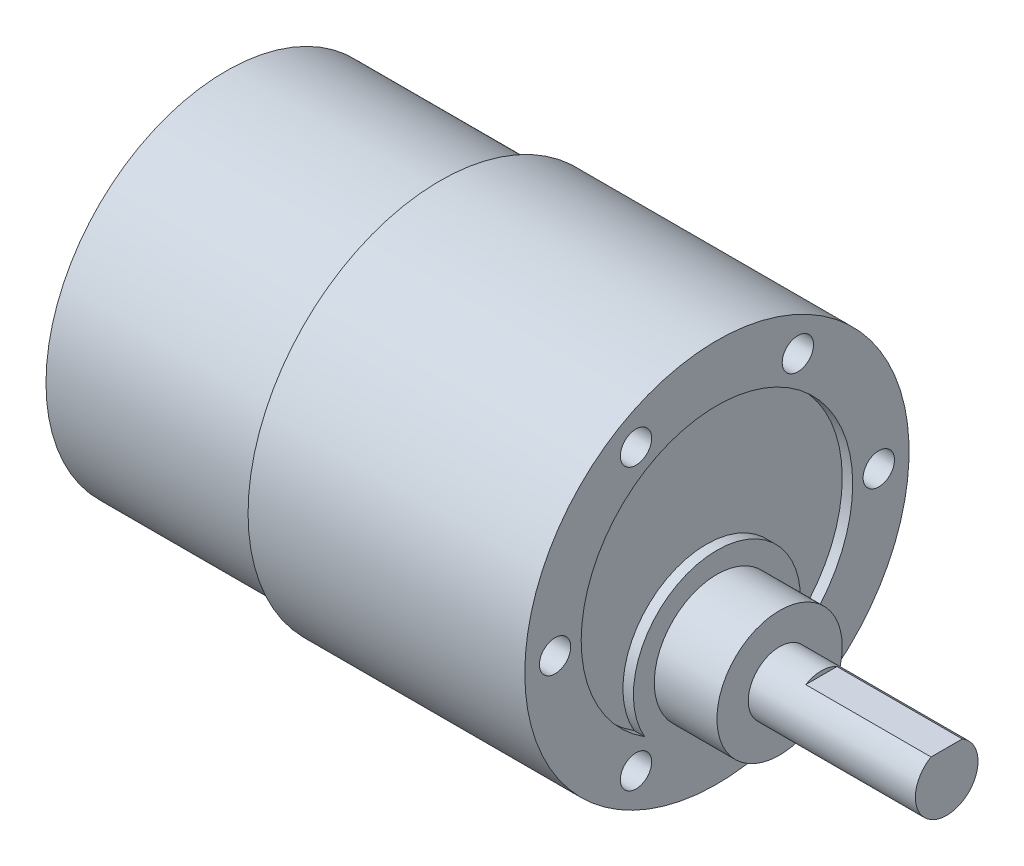
ISO-10303-21;
HEADER;
FILE_DESCRIPTION(('STEP AP214'),'2;1');
FILE_NAME('part.step','',(''),(''),'','','');
FILE_SCHEMA(('AUTOMOTIVE_DESIGN { 1 0 10303 214 1 1 1 1 }'));
ENDSEC;
DATA;
#1=APPLICATION_CONTEXT('core data for automotive mechanical design processes');
#2=APPLICATION_PROTOCOL_DEFINITION('international standard','automotive_design',2000,#1);
#3=PRODUCT_CONTEXT('',#1,'mechanical');
#4=PRODUCT('Part','Part','',(#3));
#5=PRODUCT_RELATED_PRODUCT_CATEGORY('part','',(#4));
#6=PRODUCT_DEFINITION_FORMATION('','',#4);
#7=PRODUCT_DEFINITION_CONTEXT('part definition',#1,'design');
#8=PRODUCT_DEFINITION('design','',#6,#7);
#9=PRODUCT_DEFINITION_SHAPE('','',#8);
#10=(LENGTH_UNIT() NAMED_UNIT(*) SI_UNIT(.MILLI.,.METRE.));
#11=(NAMED_UNIT(*) PLANE_ANGLE_UNIT() SI_UNIT($,.RADIAN.));
#12=(NAMED_UNIT(*) SI_UNIT($,.STERADIAN.) SOLID_ANGLE_UNIT());
#13=UNCERTAINTY_MEASURE_WITH_UNIT(LENGTH_MEASURE(1.E-05),#10,'distance_accuracy_value','');
#14=(GEOMETRIC_REPRESENTATION_CONTEXT(3) GLOBAL_UNCERTAINTY_ASSIGNED_CONTEXT((#13)) GLOBAL_UNIT_ASSIGNED_CONTEXT((#10,
#11,#12)) REPRESENTATION_CONTEXT('',''));
#15=CARTESIAN_POINT('',(0.,0.,0.));
#16=DIRECTION('',(0.,0.,1.));
#17=DIRECTION('',(1.,0.,0.));
#18=AXIS2_PLACEMENT_3D('',#15,#16,#17);
#19=CARTESIAN_POINT('',(-26.5,0.,0.));
#20=DIRECTION('',(-1.,0.,0.));
#21=DIRECTION('',(0.,0.,1.));
#22=AXIS2_PLACEMENT_3D('',#19,#20,#21);
#23=CYLINDRICAL_SURFACE('',#22,17.25);
#24=CARTESIAN_POINT('',(-26.5,0.,0.));
#25=DIRECTION('',(-1.,0.,0.));
#26=DIRECTION('',(0.,0.,1.));
#27=AXIS2_PLACEMENT_3D('',#24,#25,#26);
#28=CIRCLE('',#27,17.25);
#29=CARTESIAN_POINT('',(-26.5,0.,17.25));
#30=VERTEX_POINT('',#29);
#31=EDGE_CURVE('E11',#30,#30,#28,.T.);
#32=ORIENTED_EDGE('',*,*,#31,.T.);
#33=EDGE_LOOP('',(#32));
#34=FACE_BOUND('',#33,.T.);
#35=CARTESIAN_POINT('',(-47.,0.,0.));
#36=DIRECTION('',(-1.,0.,0.));
#37=DIRECTION('',(0.,0.,1.));
#38=AXIS2_PLACEMENT_3D('',#35,#36,#37);
#39=CIRCLE('',#38,17.25);
#40=CARTESIAN_POINT('',(-47.,0.,17.25));
#41=VERTEX_POINT('',#40);
#42=EDGE_CURVE('E87',#41,#41,#39,.T.);
#43=ORIENTED_EDGE('',*,*,#42,.F.);
#44=EDGE_LOOP('',(#43));
#45=FACE_BOUND('',#44,.T.);
#46=ADVANCED_FACE('F36',(#34,#45),#23,.T.);
#47=CARTESIAN_POINT('',(22.,-7.00000010430813,0.));
#48=DIRECTION('',(1.,0.,0.));
#49=DIRECTION('',(0.,0.,-1.));
#50=AXIS2_PLACEMENT_3D('',#47,#48,#49);
#51=PLANE('',#50);
#52=CARTESIAN_POINT('',(22.,-7.00000010430813,0.));
#53=DIRECTION('',(1.,0.,0.));
#54=DIRECTION('',(0.,0.,-1.));
#55=AXIS2_PLACEMENT_3D('',#52,#53,#54);
#56=CIRCLE('',#55,3.00000004470348);
#57=CARTESIAN_POINT('',(22.,-4.40000010430813,-1.49666304431589));
#58=VERTEX_POINT('',#57);
#59=CARTESIAN_POINT('',(22.,-4.40000010430813,1.49666304431589));
#60=VERTEX_POINT('',#59);
#61=EDGE_CURVE('E40',#58,#60,#56,.F.);
#62=ORIENTED_EDGE('',*,*,#61,.F.);
#63=DIRECTION('',(0.,0.,-1.));
#64=VECTOR('',#63,1.);
#65=CARTESIAN_POINT('',(22.,-4.40000010430813,-1.49666304431589));
#66=LINE('',#65,#64);
#67=EDGE_CURVE('E75',#58,#60,#66,.F.);
#68=ORIENTED_EDGE('',*,*,#67,.T.);
#69=EDGE_LOOP('',(#62,#68));
#70=FACE_BOUND('',#69,.T.);
#71=ADVANCED_FACE('F38',(#70),#51,.T.);
#72=CARTESIAN_POINT('',(22.,-4.40000010430813,-1.49666304431589));
#73=DIRECTION('',(0.,-1.,0.));
#74=DIRECTION('',(0.,0.,-1.));
#75=AXIS2_PLACEMENT_3D('',#72,#73,#74);
#76=PLANE('',#75);
#77=DIRECTION('',(1.,0.,0.));
#78=VECTOR('',#77,1.);
#79=CARTESIAN_POINT('',(6.,-4.40000010430813,-1.49666304431589));
#80=LINE('',#79,#78);
#81=CARTESIAN_POINT('',(10.,-4.40000010430813,-1.49666304431589));
#82=VERTEX_POINT('',#81);
#83=EDGE_CURVE('E82',#82,#58,#80,.T.);
#84=ORIENTED_EDGE('',*,*,#83,.F.);
#85=DIRECTION('',(0.,0.,-1.));
#86=VECTOR('',#85,1.);
#87=CARTESIAN_POINT('',(10.,-4.40000010430813,0.));
#88=LINE('',#87,#86);
#89=CARTESIAN_POINT('',(10.,-4.40000010430813,1.49666304431589));
#90=VERTEX_POINT('',#89);
#91=EDGE_CURVE('E86',#90,#82,#88,.T.);
#92=ORIENTED_EDGE('',*,*,#91,.F.);
#93=DIRECTION('',(1.,0.,0.));
#94=VECTOR('',#93,1.);
#95=CARTESIAN_POINT('',(6.,-4.40000010430813,1.49666304431589));
#96=LINE('',#95,#94);
#97=EDGE_CURVE('E81',#60,#90,#96,.F.);
#98=ORIENTED_EDGE('',*,*,#97,.F.);
#99=ORIENTED_EDGE('',*,*,#67,.F.);
#100=EDGE_LOOP('',(#84,#92,#98,#99));
#101=FACE_BOUND('',#100,.T.);
#102=ADVANCED_FACE('F84',(#101),#76,.F.);
#103=CARTESIAN_POINT('',(10.,-4.20000008195639,0.));
#104=DIRECTION('',(1.,0.,0.));
#105=DIRECTION('',(0.,0.,-1.));
#106=AXIS2_PLACEMENT_3D('',#103,#104,#105);
#107=PLANE('',#106);
#108=ORIENTED_EDGE('',*,*,#91,.T.);
#109=CARTESIAN_POINT('',(10.,-7.00000010430813,0.));
#110=DIRECTION('',(1.,0.,0.));
#111=DIRECTION('',(0.,0.,-1.));
#112=AXIS2_PLACEMENT_3D('',#109,#110,#111);
#113=CIRCLE('',#112,3.00000004470348);
#114=EDGE_CURVE('E92',#90,#82,#113,.F.);
#115=ORIENTED_EDGE('',*,*,#114,.F.);
#116=EDGE_LOOP('',(#108,#115));
#117=FACE_BOUND('',#116,.T.);
#118=ADVANCED_FACE('F164',(#117),#107,.T.);
#119=CARTESIAN_POINT('',(6.,-7.00000010430813,0.));
#120=DIRECTION('',(1.,0.,0.));
#121=DIRECTION('',(0.,0.,-1.));
#122=AXIS2_PLACEMENT_3D('',#119,#120,#121);
#123=CYLINDRICAL_SURFACE('',#122,3.00000004470348);
#124=CARTESIAN_POINT('',(6.,-7.00000010430813,0.));
#125=DIRECTION('',(1.,0.,0.));
#126=DIRECTION('',(0.,0.,-1.));
#127=AXIS2_PLACEMENT_3D('',#124,#125,#126);
#128=CIRCLE('',#127,3.00000004470348);
#129=CARTESIAN_POINT('',(6.,-7.00000010430813,-3.00000004470348));
#130=VERTEX_POINT('',#129);
#131=EDGE_CURVE('E155',#130,#130,#128,.F.);
#132=ORIENTED_EDGE('',*,*,#131,.F.);
#133=EDGE_LOOP('',(#132));
#134=FACE_BOUND('',#133,.T.);
#135=ORIENTED_EDGE('',*,*,#97,.T.);
#136=ORIENTED_EDGE('',*,*,#114,.T.);
#137=ORIENTED_EDGE('',*,*,#83,.T.);
#138=ORIENTED_EDGE('',*,*,#61,.T.);
#139=EDGE_LOOP('',(#135,#136,#137,#138));
#140=FACE_BOUND('',#139,.T.);
#141=ADVANCED_FACE('F90',(#134,#140),#123,.T.);
#142=CARTESIAN_POINT('',(-1.,1.00000002980232,0.));
#143=DIRECTION('',(1.,0.,0.));
#144=DIRECTION('',(0.,0.,-1.));
#145=AXIS2_PLACEMENT_3D('',#142,#143,#144);
#146=PLANE('',#145);
#147=CARTESIAN_POINT('',(-1.,0.,0.));
#148=DIRECTION('',(-1.,0.,0.));
#149=DIRECTION('',(0.,0.,1.));
#150=AXIS2_PLACEMENT_3D('',#147,#148,#149);
#151=CIRCLE('',#150,13.);
#152=CARTESIAN_POINT('',(-1.,-10.9999999403954,-6.92820332491058));
#153=VERTEX_POINT('',#152);
#154=CARTESIAN_POINT('',(-1.,-10.9999999403954,6.92820332491058));
#155=VERTEX_POINT('',#154);
#156=EDGE_CURVE('E150',#153,#155,#151,.F.);
#157=ORIENTED_EDGE('',*,*,#156,.T.);
#158=CARTESIAN_POINT('',(-1.,-7.00000010430813,0.));
#159=DIRECTION('',(-1.,0.,0.));
#160=DIRECTION('',(0.,0.,1.));
#161=AXIS2_PLACEMENT_3D('',#158,#159,#160);
#162=CIRCLE('',#161,8.);
#163=EDGE_CURVE('E153',#153,#155,#162,.F.);
#164=ORIENTED_EDGE('',*,*,#163,.F.);
#165=EDGE_LOOP('',(#157,#164));
#166=FACE_BOUND('',#165,.T.);
#167=ADVANCED_FACE('F163',(#166),#146,.T.);
#168=CARTESIAN_POINT('',(-8.,0.,-15.5));
#169=DIRECTION('',(1.,0.,0.));
#170=DIRECTION('',(0.,0.,-1.));
#171=AXIS2_PLACEMENT_3D('',#168,#169,#170);
#172=PLANE('',#171);
#173=CARTESIAN_POINT('',(-8.,0.,-15.5));
#174=DIRECTION('',(-1.,0.,0.));
#175=DIRECTION('',(0.,0.,1.));
#176=AXIS2_PLACEMENT_3D('',#173,#174,#175);
#177=CIRCLE('',#176,1.5);
#178=CARTESIAN_POINT('',(-8.,0.,-14.));
#179=VERTEX_POINT('',#178);
#180=EDGE_CURVE('E147',#179,#179,#177,.F.);
#181=ORIENTED_EDGE('',*,*,#180,.T.);
#182=EDGE_LOOP('',(#181));
#183=FACE_BOUND('',#182,.T.);
#184=ADVANCED_FACE('F170',(#183),#172,.T.);
#185=CARTESIAN_POINT('',(-8.,13.4233937586588,7.74999999999999));
#186=DIRECTION('',(1.,0.,0.));
#187=DIRECTION('',(0.,0.,-1.));
#188=AXIS2_PLACEMENT_3D('',#185,#186,#187);
#189=PLANE('',#188);
#190=CARTESIAN_POINT('',(-8.,13.4233937586588,7.74999999999999));
#191=DIRECTION('',(-1.,0.,0.));
#192=DIRECTION('',(0.,0.,1.));
#193=AXIS2_PLACEMENT_3D('',#190,#191,#192);
#194=CIRCLE('',#193,1.5);
#195=CARTESIAN_POINT('',(-8.,13.4233937586588,9.24999999999999));
#196=VERTEX_POINT('',#195);
#197=EDGE_CURVE('E144',#196,#196,#194,.F.);
#198=ORIENTED_EDGE('',*,*,#197,.T.);
#199=EDGE_LOOP('',(#198));
#200=FACE_BOUND('',#199,.T.);
#201=ADVANCED_FACE('F255',(#200),#189,.T.);
#202=CARTESIAN_POINT('',(-8.,-13.4233937586588,-7.75));
#203=DIRECTION('',(1.,0.,0.));
#204=DIRECTION('',(0.,0.,-1.));
#205=AXIS2_PLACEMENT_3D('',#202,#203,#204);
#206=PLANE('',#205);
#207=CARTESIAN_POINT('',(-8.,-13.4233937586588,-7.75));
#208=DIRECTION('',(-1.,0.,0.));
#209=DIRECTION('',(0.,0.,1.));
#210=AXIS2_PLACEMENT_3D('',#207,#208,#209);
#211=CIRCLE('',#210,1.5);
#212=CARTESIAN_POINT('',(-8.,-13.4233937586588,-6.25));
#213=VERTEX_POINT('',#212);
#214=EDGE_CURVE('E141',#213,#213,#211,.F.);
#215=ORIENTED_EDGE('',*,*,#214,.T.);
#216=EDGE_LOOP('',(#215));
#217=FACE_BOUND('',#216,.T.);
#218=ADVANCED_FACE('F251',(#217),#206,.T.);
#219=CARTESIAN_POINT('',(-8.,13.4233937586588,-7.75000000000001));
#220=DIRECTION('',(1.,0.,0.));
#221=DIRECTION('',(0.,0.,-1.));
#222=AXIS2_PLACEMENT_3D('',#219,#220,#221);
#223=PLANE('',#222);
#224=CARTESIAN_POINT('',(-8.,13.4233937586588,-7.75000000000001));
#225=DIRECTION('',(-1.,0.,0.));
#226=DIRECTION('',(0.,0.,1.));
#227=AXIS2_PLACEMENT_3D('',#224,#225,#226);
#228=CIRCLE('',#227,1.5);
#229=CARTESIAN_POINT('',(-8.,13.4233937586588,-6.25000000000001));
#230=VERTEX_POINT('',#229);
#231=EDGE_CURVE('E138',#230,#230,#228,.F.);
#232=ORIENTED_EDGE('',*,*,#231,.T.);
#233=EDGE_LOOP('',(#232));
#234=FACE_BOUND('',#233,.T.);
#235=ADVANCED_FACE('F247',(#234),#223,.T.);
#236=CARTESIAN_POINT('',(-8.,0.,15.5));
#237=DIRECTION('',(1.,0.,0.));
#238=DIRECTION('',(0.,0.,-1.));
#239=AXIS2_PLACEMENT_3D('',#236,#237,#238);
#240=PLANE('',#239);
#241=CARTESIAN_POINT('',(-8.,0.,15.5));
#242=DIRECTION('',(-1.,0.,0.));
#243=DIRECTION('',(0.,0.,1.));
#244=AXIS2_PLACEMENT_3D('',#241,#242,#243);
#245=CIRCLE('',#244,1.5);
#246=CARTESIAN_POINT('',(-8.,0.,17.));
#247=VERTEX_POINT('',#246);
#248=EDGE_CURVE('E135',#247,#247,#245,.F.);
#249=ORIENTED_EDGE('',*,*,#248,.T.);
#250=EDGE_LOOP('',(#249));
#251=FACE_BOUND('',#250,.T.);
#252=ADVANCED_FACE('F243',(#251),#240,.T.);
#253=CARTESIAN_POINT('',(-8.,-13.4233937586588,7.75));
#254=DIRECTION('',(1.,0.,0.));
#255=DIRECTION('',(0.,0.,-1.));
#256=AXIS2_PLACEMENT_3D('',#253,#254,#255);
#257=PLANE('',#256);
#258=CARTESIAN_POINT('',(-8.,-13.4233937586588,7.75));
#259=DIRECTION('',(-1.,0.,0.));
#260=DIRECTION('',(0.,0.,1.));
#261=AXIS2_PLACEMENT_3D('',#258,#259,#260);
#262=CIRCLE('',#261,1.5);
#263=CARTESIAN_POINT('',(-8.,-13.4233937586588,9.25));
#264=VERTEX_POINT('',#263);
#265=EDGE_CURVE('E132',#264,#264,#262,.F.);
#266=ORIENTED_EDGE('',*,*,#265,.T.);
#267=EDGE_LOOP('',(#266));
#268=FACE_BOUND('',#267,.T.);
#269=ADVANCED_FACE('F240',(#268),#257,.T.);
#270=CARTESIAN_POINT('',(6.,-7.00000010430813,0.));
#271=DIRECTION('',(1.,0.,0.));
#272=DIRECTION('',(0.,0.,-1.));
#273=AXIS2_PLACEMENT_3D('',#270,#271,#272);
#274=PLANE('',#273);
#275=ORIENTED_EDGE('',*,*,#131,.T.);
#276=EDGE_LOOP('',(#275));
#277=FACE_BOUND('',#276,.T.);
#278=CARTESIAN_POINT('',(6.,-7.00000010430813,0.));
#279=DIRECTION('',(1.,0.,0.));
#280=DIRECTION('',(0.,0.,-1.));
#281=AXIS2_PLACEMENT_3D('',#278,#279,#280);
#282=CIRCLE('',#281,6.);
#283=CARTESIAN_POINT('',(6.,-7.00000010430813,-6.));
#284=VERTEX_POINT('',#283);
#285=EDGE_CURVE('E129',#284,#284,#282,.F.);
#286=ORIENTED_EDGE('',*,*,#285,.F.);
#287=EDGE_LOOP('',(#286));
#288=FACE_BOUND('',#287,.T.);
#289=ADVANCED_FACE('F159',(#277,#288),#274,.T.);
#290=CARTESIAN_POINT('',(0.,-7.00000010430813,0.));
#291=DIRECTION('',(-1.,0.,0.));
#292=DIRECTION('',(0.,0.,1.));
#293=AXIS2_PLACEMENT_3D('',#290,#291,#292);
#294=CYLINDRICAL_SURFACE('',#293,8.);
#295=ORIENTED_EDGE('',*,*,#163,.T.);
#296=DIRECTION('',(-1.,0.,0.));
#297=VECTOR('',#296,1.);
#298=CARTESIAN_POINT('',(0.,-10.9999999403954,6.92820332491057));
#299=LINE('',#298,#297);
#300=CARTESIAN_POINT('',(0.,-10.9999999403954,6.92820332491058));
#301=VERTEX_POINT('',#300);
#302=EDGE_CURVE('E55',#155,#301,#299,.F.);
#303=ORIENTED_EDGE('',*,*,#302,.T.);
#304=CARTESIAN_POINT('',(0.,-7.00000010430813,0.));
#305=DIRECTION('',(-1.,0.,0.));
#306=DIRECTION('',(0.,0.,1.));
#307=AXIS2_PLACEMENT_3D('',#304,#305,#306);
#308=CIRCLE('',#307,8.);
#309=CARTESIAN_POINT('',(0.,-10.9999999403954,-6.92820332491058));
#310=VERTEX_POINT('',#309);
#311=EDGE_CURVE('E126',#310,#301,#308,.F.);
#312=ORIENTED_EDGE('',*,*,#311,.F.);
#313=DIRECTION('',(-1.,0.,0.));
#314=VECTOR('',#313,1.);
#315=CARTESIAN_POINT('',(0.,-10.9999999403954,-6.92820332491058));
#316=LINE('',#315,#314);
#317=EDGE_CURVE('E152',#310,#153,#316,.T.);
#318=ORIENTED_EDGE('',*,*,#317,.T.);
#319=EDGE_LOOP('',(#295,#303,#312,#318));
#320=FACE_BOUND('',#319,.T.);
#321=ADVANCED_FACE('F234',(#320),#294,.T.);
#322=CARTESIAN_POINT('',(0.,0.,0.));
#323=DIRECTION('',(-1.,0.,0.));
#324=DIRECTION('',(0.,0.,1.));
#325=AXIS2_PLACEMENT_3D('',#322,#323,#324);
#326=CYLINDRICAL_SURFACE('',#325,13.);
#327=ORIENTED_EDGE('',*,*,#302,.F.);
#328=ORIENTED_EDGE('',*,*,#156,.F.);
#329=ORIENTED_EDGE('',*,*,#317,.F.);
#330=CARTESIAN_POINT('',(0.,0.,0.));
#331=DIRECTION('',(-1.,0.,0.));
#332=DIRECTION('',(0.,0.,1.));
#333=AXIS2_PLACEMENT_3D('',#330,#331,#332);
#334=CIRCLE('',#333,13.);
#335=EDGE_CURVE('E123',#301,#310,#334,.T.);
#336=ORIENTED_EDGE('',*,*,#335,.F.);
#337=EDGE_LOOP('',(#327,#328,#329,#336));
#338=FACE_BOUND('',#337,.T.);
#339=ADVANCED_FACE('F230',(#338),#326,.F.);
#340=CARTESIAN_POINT('',(0.,0.,-15.5));
#341=DIRECTION('',(-1.,0.,0.));
#342=DIRECTION('',(0.,0.,1.));
#343=AXIS2_PLACEMENT_3D('',#340,#341,#342);
#344=CYLINDRICAL_SURFACE('',#343,1.5);
#345=ORIENTED_EDGE('',*,*,#180,.F.);
#346=EDGE_LOOP('',(#345));
#347=FACE_BOUND('',#346,.T.);
#348=CARTESIAN_POINT('',(0.,0.,-15.5));
#349=DIRECTION('',(-1.,0.,0.));
#350=DIRECTION('',(0.,0.,1.));
#351=AXIS2_PLACEMENT_3D('',#348,#349,#350);
#352=CIRCLE('',#351,1.5);
#353=CARTESIAN_POINT('',(0.,0.,-14.));
#354=VERTEX_POINT('',#353);
#355=EDGE_CURVE('E120',#354,#354,#352,.T.);
#356=ORIENTED_EDGE('',*,*,#355,.F.);
#357=EDGE_LOOP('',(#356));
#358=FACE_BOUND('',#357,.T.);
#359=ADVANCED_FACE('F226',(#347,#358),#344,.F.);
#360=CARTESIAN_POINT('',(0.,13.4233937586588,7.74999999999999));
#361=DIRECTION('',(-1.,0.,0.));
#362=DIRECTION('',(0.,0.,1.));
#363=AXIS2_PLACEMENT_3D('',#360,#361,#362);
#364=CYLINDRICAL_SURFACE('',#363,1.5);
#365=ORIENTED_EDGE('',*,*,#197,.F.);
#366=EDGE_LOOP('',(#365));
#367=FACE_BOUND('',#366,.T.);
#368=CARTESIAN_POINT('',(0.,13.4233937586588,7.74999999999999));
#369=DIRECTION('',(-1.,0.,0.));
#370=DIRECTION('',(0.,0.,1.));
#371=AXIS2_PLACEMENT_3D('',#368,#369,#370);
#372=CIRCLE('',#371,1.5);
#373=CARTESIAN_POINT('',(0.,13.4233937586588,9.24999999999999));
#374=VERTEX_POINT('',#373);
#375=EDGE_CURVE('E117',#374,#374,#372,.T.);
#376=ORIENTED_EDGE('',*,*,#375,.F.);
#377=EDGE_LOOP('',(#376));
#378=FACE_BOUND('',#377,.T.);
#379=ADVANCED_FACE('F222',(#367,#378),#364,.F.);
#380=CARTESIAN_POINT('',(0.,-13.4233937586588,-7.75));
#381=DIRECTION('',(-1.,0.,0.));
#382=DIRECTION('',(0.,0.,1.));
#383=AXIS2_PLACEMENT_3D('',#380,#381,#382);
#384=CYLINDRICAL_SURFACE('',#383,1.5);
#385=ORIENTED_EDGE('',*,*,#214,.F.);
#386=EDGE_LOOP('',(#385));
#387=FACE_BOUND('',#386,.T.);
#388=CARTESIAN_POINT('',(0.,-13.4233937586588,-7.75));
#389=DIRECTION('',(-1.,0.,0.));
#390=DIRECTION('',(0.,0.,1.));
#391=AXIS2_PLACEMENT_3D('',#388,#389,#390);
#392=CIRCLE('',#391,1.5);
#393=CARTESIAN_POINT('',(0.,-13.4233937586588,-6.25));
#394=VERTEX_POINT('',#393);
#395=EDGE_CURVE('E114',#394,#394,#392,.T.);
#396=ORIENTED_EDGE('',*,*,#395,.F.);
#397=EDGE_LOOP('',(#396));
#398=FACE_BOUND('',#397,.T.);
#399=ADVANCED_FACE('F218',(#387,#398),#384,.F.);
#400=CARTESIAN_POINT('',(0.,13.4233937586588,-7.75000000000001));
#401=DIRECTION('',(-1.,0.,0.));
#402=DIRECTION('',(0.,0.,1.));
#403=AXIS2_PLACEMENT_3D('',#400,#401,#402);
#404=CYLINDRICAL_SURFACE('',#403,1.5);
#405=ORIENTED_EDGE('',*,*,#231,.F.);
#406=EDGE_LOOP('',(#405));
#407=FACE_BOUND('',#406,.T.);
#408=CARTESIAN_POINT('',(0.,13.4233937586588,-7.75000000000001));
#409=DIRECTION('',(-1.,0.,0.));
#410=DIRECTION('',(0.,0.,1.));
#411=AXIS2_PLACEMENT_3D('',#408,#409,#410);
#412=CIRCLE('',#411,1.5);
#413=CARTESIAN_POINT('',(0.,13.4233937586588,-6.25000000000001));
#414=VERTEX_POINT('',#413);
#415=EDGE_CURVE('E111',#414,#414,#412,.T.);
#416=ORIENTED_EDGE('',*,*,#415,.F.);
#417=EDGE_LOOP('',(#416));
#418=FACE_BOUND('',#417,.T.);
#419=ADVANCED_FACE('F214',(#407,#418),#404,.F.);
#420=CARTESIAN_POINT('',(0.,0.,15.5));
#421=DIRECTION('',(-1.,0.,0.));
#422=DIRECTION('',(0.,0.,1.));
#423=AXIS2_PLACEMENT_3D('',#420,#421,#422);
#424=CYLINDRICAL_SURFACE('',#423,1.5);
#425=ORIENTED_EDGE('',*,*,#248,.F.);
#426=EDGE_LOOP('',(#425));
#427=FACE_BOUND('',#426,.T.);
#428=CARTESIAN_POINT('',(0.,0.,15.5));
#429=DIRECTION('',(-1.,0.,0.));
#430=DIRECTION('',(0.,0.,1.));
#431=AXIS2_PLACEMENT_3D('',#428,#429,#430);
#432=CIRCLE('',#431,1.5);
#433=CARTESIAN_POINT('',(0.,0.,17.));
#434=VERTEX_POINT('',#433);
#435=EDGE_CURVE('E108',#434,#434,#432,.T.);
#436=ORIENTED_EDGE('',*,*,#435,.F.);
#437=EDGE_LOOP('',(#436));
#438=FACE_BOUND('',#437,.T.);
#439=ADVANCED_FACE('F210',(#427,#438),#424,.F.);
#440=CARTESIAN_POINT('',(0.,-13.4233937586588,7.75));
#441=DIRECTION('',(-1.,0.,0.));
#442=DIRECTION('',(0.,0.,1.));
#443=AXIS2_PLACEMENT_3D('',#440,#441,#442);
#444=CYLINDRICAL_SURFACE('',#443,1.5);
#445=ORIENTED_EDGE('',*,*,#265,.F.);
#446=EDGE_LOOP('',(#445));
#447=FACE_BOUND('',#446,.T.);
#448=CARTESIAN_POINT('',(0.,-13.4233937586588,7.75));
#449=DIRECTION('',(-1.,0.,0.));
#450=DIRECTION('',(0.,0.,1.));
#451=AXIS2_PLACEMENT_3D('',#448,#449,#450);
#452=CIRCLE('',#451,1.5);
#453=CARTESIAN_POINT('',(0.,-13.4233937586588,9.25));
#454=VERTEX_POINT('',#453);
#455=EDGE_CURVE('E105',#454,#454,#452,.T.);
#456=ORIENTED_EDGE('',*,*,#455,.F.);
#457=EDGE_LOOP('',(#456));
#458=FACE_BOUND('',#457,.T.);
#459=ADVANCED_FACE('F206',(#447,#458),#444,.F.);
#460=CARTESIAN_POINT('',(0.,-7.00000010430813,0.));
#461=DIRECTION('',(1.,0.,0.));
#462=DIRECTION('',(0.,0.,-1.));
#463=AXIS2_PLACEMENT_3D('',#460,#461,#462);
#464=CYLINDRICAL_SURFACE('',#463,6.);
#465=CARTESIAN_POINT('',(0.,-7.00000010430813,0.));
#466=DIRECTION('',(1.,0.,0.));
#467=DIRECTION('',(0.,0.,-1.));
#468=AXIS2_PLACEMENT_3D('',#465,#466,#467);
#469=CIRCLE('',#468,6.);
#470=CARTESIAN_POINT('',(0.,-7.00000010430813,-6.));
#471=VERTEX_POINT('',#470);
#472=EDGE_CURVE('E102',#471,#471,#469,.F.);
#473=ORIENTED_EDGE('',*,*,#472,.F.);
#474=EDGE_LOOP('',(#473));
#475=FACE_BOUND('',#474,.T.);
#476=ORIENTED_EDGE('',*,*,#285,.T.);
#477=EDGE_LOOP('',(#476));
#478=FACE_BOUND('',#477,.T.);
#479=ADVANCED_FACE('F202',(#475,#478),#464,.T.);
#480=CARTESIAN_POINT('',(0.,0.,0.));
#481=DIRECTION('',(1.,0.,0.));
#482=DIRECTION('',(0.,0.,-1.));
#483=AXIS2_PLACEMENT_3D('',#480,#481,#482);
#484=PLANE('',#483);
#485=ORIENTED_EDGE('',*,*,#472,.T.);
#486=EDGE_LOOP('',(#485));
#487=FACE_BOUND('',#486,.T.);
#488=ORIENTED_EDGE('',*,*,#455,.T.);
#489=EDGE_LOOP('',(#488));
#490=FACE_BOUND('',#489,.T.);
#491=ORIENTED_EDGE('',*,*,#435,.T.);
#492=EDGE_LOOP('',(#491));
#493=FACE_BOUND('',#492,.T.);
#494=ORIENTED_EDGE('',*,*,#415,.T.);
#495=EDGE_LOOP('',(#494));
#496=FACE_BOUND('',#495,.T.);
#497=ORIENTED_EDGE('',*,*,#395,.T.);
#498=EDGE_LOOP('',(#497));
#499=FACE_BOUND('',#498,.T.);
#500=ORIENTED_EDGE('',*,*,#375,.T.);
#501=EDGE_LOOP('',(#500));
#502=FACE_BOUND('',#501,.T.);
#503=ORIENTED_EDGE('',*,*,#355,.T.);
#504=EDGE_LOOP('',(#503));
#505=FACE_BOUND('',#504,.T.);
#506=ORIENTED_EDGE('',*,*,#311,.T.);
#507=ORIENTED_EDGE('',*,*,#335,.T.);
#508=EDGE_LOOP('',(#506,#507));
#509=FACE_BOUND('',#508,.T.);
#510=CARTESIAN_POINT('',(0.,0.,0.));
#511=DIRECTION('',(-1.,0.,0.));
#512=DIRECTION('',(0.,0.,1.));
#513=AXIS2_PLACEMENT_3D('',#510,#511,#512);
#514=CIRCLE('',#513,18.4);
#515=CARTESIAN_POINT('',(0.,0.,18.4));
#516=VERTEX_POINT('',#515);
#517=EDGE_CURVE('E99',#516,#516,#514,.T.);
#518=ORIENTED_EDGE('',*,*,#517,.F.);
#519=EDGE_LOOP('',(#518));
#520=FACE_BOUND('',#519,.T.);
#521=ADVANCED_FACE('F194',(#487,#490,#493,#496,#499,#502,#505,#509,#520),#484,.T.);
#522=CARTESIAN_POINT('',(0.,0.,0.));
#523=DIRECTION('',(-1.,0.,0.));
#524=DIRECTION('',(0.,0.,1.));
#525=AXIS2_PLACEMENT_3D('',#522,#523,#524);
#526=CYLINDRICAL_SURFACE('',#525,18.4);
#527=ORIENTED_EDGE('',*,*,#517,.T.);
#528=EDGE_LOOP('',(#527));
#529=FACE_BOUND('',#528,.T.);
#530=CARTESIAN_POINT('',(-26.5,0.,0.));
#531=DIRECTION('',(-1.,0.,0.));
#532=DIRECTION('',(0.,0.,1.));
#533=AXIS2_PLACEMENT_3D('',#530,#531,#532);
#534=CIRCLE('',#533,18.4);
#535=CARTESIAN_POINT('',(-26.5,0.,18.4));
#536=VERTEX_POINT('',#535);
#537=EDGE_CURVE('E46',#536,#536,#534,.F.);
#538=ORIENTED_EDGE('',*,*,#537,.T.);
#539=EDGE_LOOP('',(#538));
#540=FACE_BOUND('',#539,.T.);
#541=ADVANCED_FACE('F187',(#529,#540),#526,.T.);
#542=CARTESIAN_POINT('',(-26.5,0.,0.));
#543=DIRECTION('',(1.,0.,0.));
#544=DIRECTION('',(0.,0.,-1.));
#545=AXIS2_PLACEMENT_3D('',#542,#543,#544);
#546=PLANE('',#545);
#547=ORIENTED_EDGE('',*,*,#31,.F.);
#548=EDGE_LOOP('',(#547));
#549=FACE_BOUND('',#548,.T.);
#550=ORIENTED_EDGE('',*,*,#537,.F.);
#551=EDGE_LOOP('',(#550));
#552=FACE_BOUND('',#551,.T.);
#553=ADVANCED_FACE('F178',(#549,#552),#546,.F.);
#554=CARTESIAN_POINT('',(-47.,0.,0.));
#555=DIRECTION('',(-1.,0.,0.));
#556=DIRECTION('',(0.,0.,1.));
#557=AXIS2_PLACEMENT_3D('',#554,#555,#556);
#558=PLANE('',#557);
#559=ORIENTED_EDGE('',*,*,#42,.T.);
#560=EDGE_LOOP('',(#559));
#561=FACE_BOUND('',#560,.T.);
#562=ADVANCED_FACE('F182',(#561),#558,.T.);
#563=CLOSED_SHELL('',(#46,#71,#102,#118,#141,#167,#184,#201,#218,#235,#252,#269,#289,#321,#339,
#359,#379,#399,#419,#439,#459,#479,#521,#541,#553,#562));
#564=MANIFOLD_SOLID_BREP('B2',#563);
#565=ADVANCED_BREP_SHAPE_REPRESENTATION('',(#18,#564),#14);
#566=SHAPE_DEFINITION_REPRESENTATION(#9,#565);
ENDSEC;
END-ISO-10303-21;
